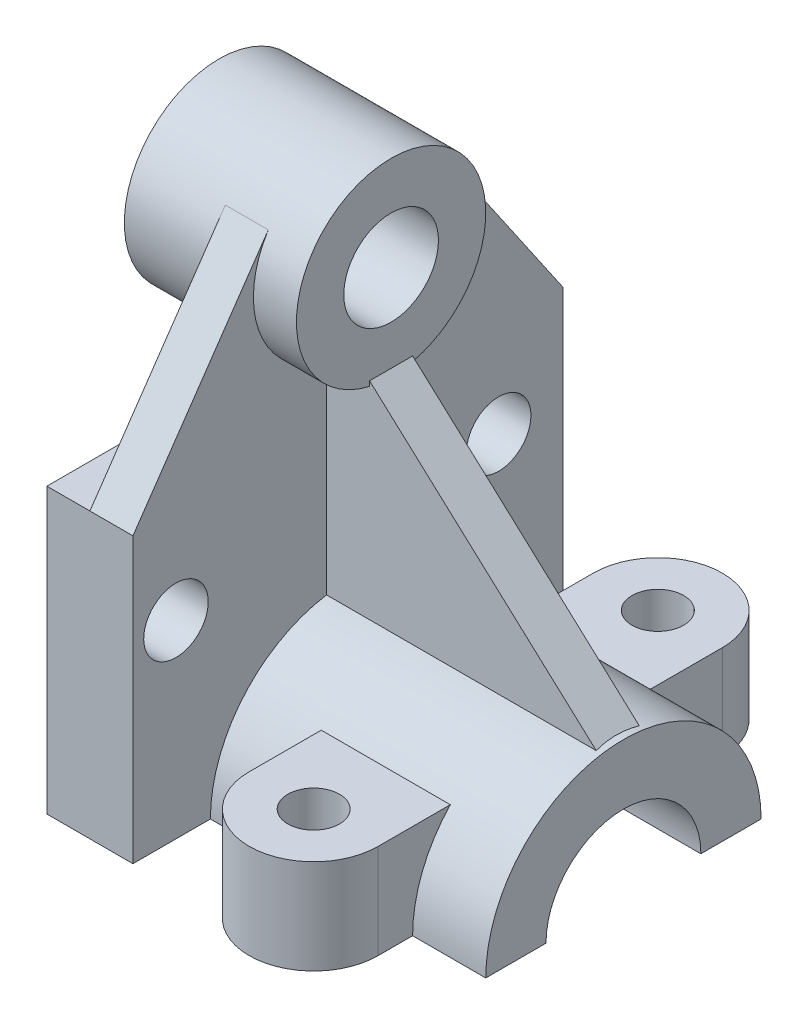
ISO-10303-21;
HEADER;
FILE_DESCRIPTION(('STEP AP214'),'2;1');
FILE_NAME('part.step','',(''),(''),'','','');
FILE_SCHEMA(('AUTOMOTIVE_DESIGN { 1 0 10303 214 1 1 1 1 }'));
ENDSEC;
DATA;
#1=APPLICATION_CONTEXT('core data for automotive mechanical design processes');
#2=APPLICATION_PROTOCOL_DEFINITION('international standard','automotive_design',2000,#1);
#3=PRODUCT_CONTEXT('',#1,'mechanical');
#4=PRODUCT('Part','Part','',(#3));
#5=PRODUCT_RELATED_PRODUCT_CATEGORY('part','',(#4));
#6=PRODUCT_DEFINITION_FORMATION('','',#4);
#7=PRODUCT_DEFINITION_CONTEXT('part definition',#1,'design');
#8=PRODUCT_DEFINITION('design','',#6,#7);
#9=PRODUCT_DEFINITION_SHAPE('','',#8);
#10=(LENGTH_UNIT() NAMED_UNIT(*) SI_UNIT(.MILLI.,.METRE.));
#11=(NAMED_UNIT(*) PLANE_ANGLE_UNIT() SI_UNIT($,.RADIAN.));
#12=(NAMED_UNIT(*) SI_UNIT($,.STERADIAN.) SOLID_ANGLE_UNIT());
#13=UNCERTAINTY_MEASURE_WITH_UNIT(LENGTH_MEASURE(1.E-05),#10,'distance_accuracy_value','');
#14=(GEOMETRIC_REPRESENTATION_CONTEXT(3) GLOBAL_UNCERTAINTY_ASSIGNED_CONTEXT((#13)) GLOBAL_UNIT_ASSIGNED_CONTEXT((#10,
#11,#12)) REPRESENTATION_CONTEXT('',''));
#15=CARTESIAN_POINT('',(0.,0.,0.));
#16=DIRECTION('',(0.,0.,1.));
#17=DIRECTION('',(1.,0.,0.));
#18=AXIS2_PLACEMENT_3D('',#15,#16,#17);
#19=CARTESIAN_POINT('',(-2.10138248847927,66.,-100.));
#20=DIRECTION('',(1.,0.,0.));
#21=DIRECTION('',(0.,1.,0.));
#22=AXIS2_PLACEMENT_3D('',#19,#20,#21);
#23=PLANE('',#22);
#24=CARTESIAN_POINT('',(-2.10138248847927,44.,-85.));
#25=DIRECTION('',(1.,0.,0.));
#26=DIRECTION('',(0.,1.,0.));
#27=AXIS2_PLACEMENT_3D('',#24,#25,#26);
#28=CIRCLE('',#27,7.50000000000001);
#29=CARTESIAN_POINT('',(-2.10138248847927,51.5,-85.));
#30=VERTEX_POINT('',#29);
#31=EDGE_CURVE('E408',#30,#30,#28,.T.);
#32=ORIENTED_EDGE('',*,*,#31,.F.);
#33=EDGE_LOOP('',(#32));
#34=FACE_BOUND('',#33,.T.);
#35=CARTESIAN_POINT('',(-2.10138248847928,100.,-50.));
#36=DIRECTION('',(1.,0.,0.));
#37=DIRECTION('',(0.,1.,0.));
#38=AXIS2_PLACEMENT_3D('',#35,#36,#37);
#39=CIRCLE('',#38,22.);
#40=CARTESIAN_POINT('',(-2.10138248847927,78.5757147143715,-55.));
#41=VERTEX_POINT('',#40);
#42=CARTESIAN_POINT('',(-2.10138248847927,111.84786490349,-68.537208452964));
#43=VERTEX_POINT('',#42);
#44=EDGE_CURVE('E353',#41,#43,#39,.T.);
#45=ORIENTED_EDGE('',*,*,#44,.F.);
#46=DIRECTION('',(0.,-1.,0.));
#47=VECTOR('',#46,1.);
#48=CARTESIAN_POINT('',(-2.10138248847927,66.,-55.));
#49=LINE('',#48,#47);
#50=CARTESIAN_POINT('',(-2.10138248847926,31.6069612585582,-55.));
#51=VERTEX_POINT('',#50);
#52=EDGE_CURVE('E291',#41,#51,#49,.T.);
#53=ORIENTED_EDGE('',*,*,#52,.T.);
#54=CARTESIAN_POINT('',(-2.10138248847926,0.,-50.));
#55=DIRECTION('',(1.,0.,0.));
#56=DIRECTION('',(0.,1.,0.));
#57=AXIS2_PLACEMENT_3D('',#54,#55,#56);
#58=CIRCLE('',#57,32.);
#59=CARTESIAN_POINT('',(-2.10138248847926,0.,-82.));
#60=VERTEX_POINT('',#59);
#61=EDGE_CURVE('E307',#60,#51,#58,.T.);
#62=ORIENTED_EDGE('',*,*,#61,.F.);
#63=DIRECTION('',(0.,0.,1.));
#64=VECTOR('',#63,1.);
#65=CARTESIAN_POINT('',(-2.10138248847926,0.,-100.));
#66=LINE('',#65,#64);
#67=CARTESIAN_POINT('',(-2.10138248847926,0.,-100.));
#68=VERTEX_POINT('',#67);
#69=EDGE_CURVE('E396',#68,#60,#66,.T.);
#70=ORIENTED_EDGE('',*,*,#69,.F.);
#71=DIRECTION('',(0.,1.,0.));
#72=VECTOR('',#71,1.);
#73=CARTESIAN_POINT('',(-2.10138248847927,66.,-100.));
#74=LINE('',#73,#72);
#75=CARTESIAN_POINT('',(-2.10138248847927,66.,-100.));
#76=VERTEX_POINT('',#75);
#77=EDGE_CURVE('E370',#68,#76,#74,.T.);
#78=ORIENTED_EDGE('',*,*,#77,.T.);
#79=DIRECTION('',(0.,-0.824525346118372,-0.565825020309617));
#80=VECTOR('',#79,1.);
#81=CARTESIAN_POINT('',(-2.10138248847927,67.7841320094752,-98.7756513062348));
#82=LINE('',#81,#80);
#83=EDGE_CURVE('E349',#43,#76,#82,.T.);
#84=ORIENTED_EDGE('',*,*,#83,.F.);
#85=EDGE_LOOP('',(#45,#53,#62,#70,#78,#84));
#86=FACE_BOUND('',#85,.T.);
#87=ADVANCED_FACE('F39',(#34,#86),#23,.T.);
#88=CARTESIAN_POINT('',(-12.1013824884793,100.,-50.));
#89=DIRECTION('',(1.,0.,0.));
#90=DIRECTION('',(0.,1.,0.));
#91=AXIS2_PLACEMENT_3D('',#88,#89,#90);
#92=CYLINDRICAL_SURFACE('',#91,22.);
#93=CARTESIAN_POINT('',(-32.1013824884793,100.,-50.));
#94=DIRECTION('',(1.,0.,0.));
#95=DIRECTION('',(0.,1.,0.));
#96=AXIS2_PLACEMENT_3D('',#93,#94,#95);
#97=CIRCLE('',#96,22.);
#98=CARTESIAN_POINT('',(-32.1013824884793,122.,-50.));
#99=VERTEX_POINT('',#98);
#100=EDGE_CURVE('E331',#99,#99,#97,.T.);
#101=ORIENTED_EDGE('',*,*,#100,.T.);
#102=EDGE_LOOP('',(#101));
#103=FACE_BOUND('',#102,.T.);
#104=CARTESIAN_POINT('',(7.89861751152072,100.,-50.));
#105=DIRECTION('',(1.,0.,0.));
#106=DIRECTION('',(0.,1.,0.));
#107=AXIS2_PLACEMENT_3D('',#104,#105,#106);
#108=CIRCLE('',#107,22.);
#109=CARTESIAN_POINT('',(7.89861751152071,78.5757147143715,-55.));
#110=VERTEX_POINT('',#109);
#111=CARTESIAN_POINT('',(7.89861751152071,78.5757147143715,-45.));
#112=VERTEX_POINT('',#111);
#113=EDGE_CURVE('E346',#110,#112,#108,.T.);
#114=ORIENTED_EDGE('',*,*,#113,.F.);
#115=DIRECTION('',(1.,0.,0.));
#116=VECTOR('',#115,1.);
#117=CARTESIAN_POINT('',(-12.1013824884793,78.5757147143715,-55.));
#118=LINE('',#117,#116);
#119=EDGE_CURVE('E294',#110,#41,#118,.F.);
#120=ORIENTED_EDGE('',*,*,#119,.T.);
#121=ORIENTED_EDGE('',*,*,#44,.T.);
#122=DIRECTION('',(1.,0.,0.));
#123=VECTOR('',#122,1.);
#124=CARTESIAN_POINT('',(-32.1013824884793,111.84786490349,-68.537208452964));
#125=LINE('',#124,#123);
#126=CARTESIAN_POINT('',(-12.1013824884793,111.847864903491,-68.5372084529638));
#127=VERTEX_POINT('',#126);
#128=EDGE_CURVE('E340',#127,#43,#125,.T.);
#129=ORIENTED_EDGE('',*,*,#128,.F.);
#130=CARTESIAN_POINT('',(-12.1013824884793,100.,-50.));
#131=DIRECTION('',(1.,0.,0.));
#132=DIRECTION('',(0.,1.,0.));
#133=AXIS2_PLACEMENT_3D('',#130,#131,#132);
#134=CIRCLE('',#133,22.);
#135=CARTESIAN_POINT('',(-12.1013824884793,111.847864903491,-31.4627915470364));
#136=VERTEX_POINT('',#135);
#137=EDGE_CURVE('E337',#136,#127,#134,.T.);
#138=ORIENTED_EDGE('',*,*,#137,.F.);
#139=DIRECTION('',(1.,0.,0.));
#140=VECTOR('',#139,1.);
#141=CARTESIAN_POINT('',(-32.1013824884793,111.847864903491,-31.4627915470364));
#142=LINE('',#141,#140);
#143=CARTESIAN_POINT('',(-2.10138248847928,111.847864903491,-31.4627915470362));
#144=VERTEX_POINT('',#143);
#145=EDGE_CURVE('E334',#144,#136,#142,.F.);
#146=ORIENTED_EDGE('',*,*,#145,.F.);
#147=CARTESIAN_POINT('',(-2.10138248847927,78.5757147143715,-45.));
#148=VERTEX_POINT('',#147);
#149=EDGE_CURVE('E350',#144,#148,#39,.T.);
#150=ORIENTED_EDGE('',*,*,#149,.T.);
#151=DIRECTION('',(1.,0.,0.));
#152=VECTOR('',#151,1.);
#153=CARTESIAN_POINT('',(-12.1013824884793,78.5757147143715,-45.));
#154=LINE('',#153,#152);
#155=EDGE_CURVE('E285',#112,#148,#154,.F.);
#156=ORIENTED_EDGE('',*,*,#155,.F.);
#157=EDGE_LOOP('',(#114,#120,#121,#129,#138,#146,#150,#156));
#158=FACE_BOUND('',#157,.T.);
#159=ADVANCED_FACE('F433',(#103,#158),#92,.T.);
#160=CARTESIAN_POINT('',(7.89861751152072,100.,-50.));
#161=DIRECTION('',(1.,0.,0.));
#162=DIRECTION('',(0.,1.,0.));
#163=AXIS2_PLACEMENT_3D('',#160,#161,#162);
#164=PLANE('',#163);
#165=CARTESIAN_POINT('',(7.89861751152072,100.,-50.));
#166=DIRECTION('',(1.,0.,0.));
#167=DIRECTION('',(0.,1.,0.));
#168=AXIS2_PLACEMENT_3D('',#165,#166,#167);
#169=CIRCLE('',#168,11.);
#170=CARTESIAN_POINT('',(7.89861751152072,111.,-50.));
#171=VERTEX_POINT('',#170);
#172=EDGE_CURVE('E343',#171,#171,#169,.T.);
#173=ORIENTED_EDGE('',*,*,#172,.F.);
#174=EDGE_LOOP('',(#173));
#175=FACE_BOUND('',#174,.T.);
#176=DIRECTION('',(0.,0.,1.));
#177=VECTOR('',#176,1.);
#178=CARTESIAN_POINT('',(7.89861751152073,79.7071357753525,-55.));
#179=LINE('',#178,#177);
#180=CARTESIAN_POINT('',(7.89861751152073,79.7071357753525,-55.));
#181=VERTEX_POINT('',#180);
#182=CARTESIAN_POINT('',(7.89861751152073,79.7071357753525,-45.));
#183=VERTEX_POINT('',#182);
#184=EDGE_CURVE('E276',#181,#183,#179,.T.);
#185=ORIENTED_EDGE('',*,*,#184,.F.);
#186=DIRECTION('',(0.,-1.,0.));
#187=VECTOR('',#186,1.);
#188=CARTESIAN_POINT('',(7.89861751152072,100.,-55.));
#189=LINE('',#188,#187);
#190=EDGE_CURVE('E297',#181,#110,#189,.T.);
#191=ORIENTED_EDGE('',*,*,#190,.T.);
#192=ORIENTED_EDGE('',*,*,#113,.T.);
#193=DIRECTION('',(0.,-1.,0.));
#194=VECTOR('',#193,1.);
#195=CARTESIAN_POINT('',(7.89861751152072,100.,-45.));
#196=LINE('',#195,#194);
#197=EDGE_CURVE('E287',#183,#112,#196,.T.);
#198=ORIENTED_EDGE('',*,*,#197,.F.);
#199=EDGE_LOOP('',(#185,#191,#192,#198));
#200=FACE_BOUND('',#199,.T.);
#201=ADVANCED_FACE('F440',(#175,#200),#164,.T.);
#202=CARTESIAN_POINT('',(61.8986175115207,0.,-50.));
#203=DIRECTION('',(-1.,0.,0.));
#204=DIRECTION('',(0.,-1.,0.));
#205=AXIS2_PLACEMENT_3D('',#202,#203,#204);
#206=CYLINDRICAL_SURFACE('',#205,32.);
#207=DIRECTION('',(-1.,0.,0.));
#208=VECTOR('',#207,1.);
#209=CARTESIAN_POINT('',(61.8986175115207,0.,-82.));
#210=LINE('',#209,#208);
#211=CARTESIAN_POINT('',(61.8986175115207,0.,-82.));
#212=VERTEX_POINT('',#211);
#213=CARTESIAN_POINT('',(44.8986175115207,0.,-82.));
#214=VERTEX_POINT('',#213);
#215=EDGE_CURVE('E324',#212,#214,#210,.T.);
#216=ORIENTED_EDGE('',*,*,#215,.T.);
#217=CARTESIAN_POINT('',(44.8986175115207,0.,-50.));
#218=DIRECTION('',(1.,0.,0.));
#219=DIRECTION('',(0.,1.,0.));
#220=AXIS2_PLACEMENT_3D('',#217,#218,#219);
#221=CIRCLE('',#220,32.);
#222=CARTESIAN_POINT('',(44.8986175115207,22.,-73.2379000772445));
#223=VERTEX_POINT('',#222);
#224=EDGE_CURVE('E56',#214,#223,#221,.T.);
#225=ORIENTED_EDGE('',*,*,#224,.T.);
#226=DIRECTION('',(-1.,0.,0.));
#227=VECTOR('',#226,1.);
#228=CARTESIAN_POINT('',(61.8986175115207,22.,-73.2379000772445));
#229=LINE('',#228,#227);
#230=CARTESIAN_POINT('',(14.8986175115207,22.,-73.2379000772445));
#231=VERTEX_POINT('',#230);
#232=EDGE_CURVE('E11',#231,#223,#229,.F.);
#233=ORIENTED_EDGE('',*,*,#232,.F.);
#234=CARTESIAN_POINT('',(14.8986175115207,0.,-50.));
#235=DIRECTION('',(-1.,0.,0.));
#236=DIRECTION('',(0.,0.,1.));
#237=AXIS2_PLACEMENT_3D('',#234,#235,#236);
#238=CIRCLE('',#237,32.);
#239=CARTESIAN_POINT('',(14.8986175115207,0.,-82.));
#240=VERTEX_POINT('',#239);
#241=EDGE_CURVE('E235',#231,#240,#238,.T.);
#242=ORIENTED_EDGE('',*,*,#241,.T.);
#243=EDGE_CURVE('E323',#240,#60,#210,.T.);
#244=ORIENTED_EDGE('',*,*,#243,.T.);
#245=ORIENTED_EDGE('',*,*,#61,.T.);
#246=DIRECTION('',(-1.,0.,0.));
#247=VECTOR('',#246,1.);
#248=CARTESIAN_POINT('',(61.8986175115207,31.6069612585582,-55.));
#249=LINE('',#248,#247);
#250=CARTESIAN_POINT('',(60.5799763867612,31.6069612585582,-55.));
#251=VERTEX_POINT('',#250);
#252=EDGE_CURVE('E289',#251,#51,#249,.T.);
#253=ORIENTED_EDGE('',*,*,#252,.F.);
#254=CARTESIAN_POINT('',(95.1972659443398,0.,-50.));
#255=DIRECTION('',(-0.674267860809135,-0.738486866423414,0.));
#256=DIRECTION('',(-0.738486866423414,0.674267860809135,0.));
#257=AXIS2_PLACEMENT_3D('',#254,#255,#256);
#258=ELLIPSE('',#257,47.4588837166276,32.);
#259=CARTESIAN_POINT('',(60.5799763867612,31.6069612585582,-45.));
#260=VERTEX_POINT('',#259);
#261=EDGE_CURVE('E300',#260,#251,#258,.T.);
#262=ORIENTED_EDGE('',*,*,#261,.F.);
#263=DIRECTION('',(-1.,0.,0.));
#264=VECTOR('',#263,1.);
#265=CARTESIAN_POINT('',(61.8986175115207,31.6069612585582,-45.));
#266=LINE('',#265,#264);
#267=CARTESIAN_POINT('',(-2.10138248847927,31.6069612585582,-45.));
#268=VERTEX_POINT('',#267);
#269=EDGE_CURVE('E280',#260,#268,#266,.T.);
#270=ORIENTED_EDGE('',*,*,#269,.T.);
#271=CARTESIAN_POINT('',(-2.10138248847926,0.,-18.));
#272=VERTEX_POINT('',#271);
#273=EDGE_CURVE('E314',#268,#272,#58,.T.);
#274=ORIENTED_EDGE('',*,*,#273,.T.);
#275=DIRECTION('',(-1.,0.,0.));
#276=VECTOR('',#275,1.);
#277=CARTESIAN_POINT('',(61.8986175115207,0.,-18.));
#278=LINE('',#277,#276);
#279=CARTESIAN_POINT('',(14.8986175115207,0.,-18.));
#280=VERTEX_POINT('',#279);
#281=EDGE_CURVE('E319',#280,#272,#278,.T.);
#282=ORIENTED_EDGE('',*,*,#281,.F.);
#283=CARTESIAN_POINT('',(14.8986175115207,0.,-50.));
#284=DIRECTION('',(-1.,0.,0.));
#285=DIRECTION('',(0.,-1.,0.));
#286=AXIS2_PLACEMENT_3D('',#283,#284,#285);
#287=CIRCLE('',#286,32.);
#288=CARTESIAN_POINT('',(14.8986175115207,22.,-26.7620999227555));
#289=VERTEX_POINT('',#288);
#290=EDGE_CURVE('E269',#280,#289,#287,.T.);
#291=ORIENTED_EDGE('',*,*,#290,.T.);
#292=DIRECTION('',(-1.,0.,0.));
#293=VECTOR('',#292,1.);
#294=CARTESIAN_POINT('',(61.8986175115207,22.,-26.7620999227555));
#295=LINE('',#294,#293);
#296=CARTESIAN_POINT('',(44.8986175115207,22.,-26.7620999227555));
#297=VERTEX_POINT('',#296);
#298=EDGE_CURVE('E48',#289,#297,#295,.F.);
#299=ORIENTED_EDGE('',*,*,#298,.T.);
#300=CARTESIAN_POINT('',(44.8986175115207,0.,-50.));
#301=DIRECTION('',(1.,0.,0.));
#302=DIRECTION('',(0.,0.,-1.));
#303=AXIS2_PLACEMENT_3D('',#300,#301,#302);
#304=CIRCLE('',#303,32.);
#305=CARTESIAN_POINT('',(44.8986175115207,0.,-18.));
#306=VERTEX_POINT('',#305);
#307=EDGE_CURVE('E264',#297,#306,#304,.T.);
#308=ORIENTED_EDGE('',*,*,#307,.T.);
#309=CARTESIAN_POINT('',(61.8986175115207,0.,-18.));
#310=VERTEX_POINT('',#309);
#311=EDGE_CURVE('E320',#310,#306,#278,.T.);
#312=ORIENTED_EDGE('',*,*,#311,.F.);
#313=CARTESIAN_POINT('',(61.8986175115207,0.,-50.));
#314=DIRECTION('',(1.,0.,0.));
#315=DIRECTION('',(0.,1.,0.));
#316=AXIS2_PLACEMENT_3D('',#313,#314,#315);
#317=CIRCLE('',#316,32.);
#318=EDGE_CURVE('E309',#212,#310,#317,.T.);
#319=ORIENTED_EDGE('',*,*,#318,.F.);
#320=EDGE_LOOP('',(#216,#225,#233,#242,#244,#245,#253,#262,#270,#274,#282,#291,#299,#308,#312,#319));
#321=FACE_BOUND('',#320,.T.);
#322=ADVANCED_FACE('F447',(#321),#206,.T.);
#323=CARTESIAN_POINT('',(-2.10138248847927,44.,-10.));
#324=DIRECTION('',(1.,0.,0.));
#325=DIRECTION('',(0.,1.,0.));
#326=AXIS2_PLACEMENT_3D('',#323,#324,#325);
#327=CIRCLE('',#326,7.5);
#328=CARTESIAN_POINT('',(-2.10138248847927,51.5,-10.));
#329=VERTEX_POINT('',#328);
#330=EDGE_CURVE('E403',#329,#329,#327,.T.);
#331=ORIENTED_EDGE('',*,*,#330,.F.);
#332=EDGE_LOOP('',(#331));
#333=FACE_BOUND('',#332,.T.);
#334=DIRECTION('',(0.,-1.,0.));
#335=VECTOR('',#334,1.);
#336=CARTESIAN_POINT('',(-2.10138248847927,66.,-45.));
#337=LINE('',#336,#335);
#338=EDGE_CURVE('E283',#148,#268,#337,.T.);
#339=ORIENTED_EDGE('',*,*,#338,.F.);
#340=ORIENTED_EDGE('',*,*,#149,.F.);
#341=DIRECTION('',(0.,0.824525346118372,-0.565825020309617));
#342=VECTOR('',#341,1.);
#343=CARTESIAN_POINT('',(-2.10138248847927,21.130424938153,30.7914466670727));
#344=LINE('',#343,#342);
#345=CARTESIAN_POINT('',(-2.10138248847927,66.,0.));
#346=VERTEX_POINT('',#345);
#347=EDGE_CURVE('E357',#346,#144,#344,.T.);
#348=ORIENTED_EDGE('',*,*,#347,.F.);
#349=DIRECTION('',(0.,1.,0.));
#350=VECTOR('',#349,1.);
#351=CARTESIAN_POINT('',(-2.10138248847927,66.,0.));
#352=LINE('',#351,#350);
#353=CARTESIAN_POINT('',(-2.10138248847926,0.,0.));
#354=VERTEX_POINT('',#353);
#355=EDGE_CURVE('E384',#354,#346,#352,.T.);
#356=ORIENTED_EDGE('',*,*,#355,.F.);
#357=EDGE_CURVE('E381',#272,#354,#66,.T.);
#358=ORIENTED_EDGE('',*,*,#357,.F.);
#359=ORIENTED_EDGE('',*,*,#273,.F.);
#360=EDGE_LOOP('',(#339,#340,#348,#356,#358,#359));
#361=FACE_BOUND('',#360,.T.);
#362=ADVANCED_FACE('F435',(#333,#361),#23,.T.);
#363=CARTESIAN_POINT('',(-2.10138248847926,0.,-100.));
#364=DIRECTION('',(0.,-1.,0.));
#365=DIRECTION('',(1.,0.,0.));
#366=AXIS2_PLACEMENT_3D('',#363,#364,#365);
#367=PLANE('',#366);
#368=ORIENTED_EDGE('',*,*,#243,.F.);
#369=DIRECTION('',(0.,0.,-1.));
#370=VECTOR('',#369,1.);
#371=CARTESIAN_POINT('',(14.8986175115207,0.,-68.));
#372=LINE('',#371,#370);
#373=CARTESIAN_POINT('',(14.8986175115207,0.,-90.));
#374=VERTEX_POINT('',#373);
#375=EDGE_CURVE('E218',#240,#374,#372,.T.);
#376=ORIENTED_EDGE('',*,*,#375,.T.);
#377=CARTESIAN_POINT('',(29.8986175115207,0.,-90.));
#378=DIRECTION('',(0.,-1.,0.));
#379=DIRECTION('',(1.,0.,0.));
#380=AXIS2_PLACEMENT_3D('',#377,#378,#379);
#381=CIRCLE('',#380,15.);
#382=CARTESIAN_POINT('',(44.8986175115207,0.,-90.));
#383=VERTEX_POINT('',#382);
#384=EDGE_CURVE('E203',#374,#383,#381,.T.);
#385=ORIENTED_EDGE('',*,*,#384,.T.);
#386=DIRECTION('',(0.,0.,1.));
#387=VECTOR('',#386,1.);
#388=CARTESIAN_POINT('',(44.8986175115207,0.,-68.));
#389=LINE('',#388,#387);
#390=EDGE_CURVE('E216',#383,#214,#389,.T.);
#391=ORIENTED_EDGE('',*,*,#390,.T.);
#392=ORIENTED_EDGE('',*,*,#215,.F.);
#393=DIRECTION('',(0.,0.,-1.));
#394=VECTOR('',#393,1.);
#395=CARTESIAN_POINT('',(61.8986175115207,0.,0.));
#396=LINE('',#395,#394);
#397=CARTESIAN_POINT('',(61.8986175115207,0.,-68.));
#398=VERTEX_POINT('',#397);
#399=EDGE_CURVE('E306',#398,#212,#396,.T.);
#400=ORIENTED_EDGE('',*,*,#399,.F.);
#401=DIRECTION('',(-1.,0.,0.));
#402=VECTOR('',#401,1.);
#403=CARTESIAN_POINT('',(61.8986175115207,0.,-68.));
#404=LINE('',#403,#402);
#405=CARTESIAN_POINT('',(-2.10138248847926,0.,-68.));
#406=VERTEX_POINT('',#405);
#407=EDGE_CURVE('E326',#398,#406,#404,.T.);
#408=ORIENTED_EDGE('',*,*,#407,.T.);
#409=CARTESIAN_POINT('',(-2.10138248847926,0.,-32.));
#410=VERTEX_POINT('',#409);
#411=EDGE_CURVE('E399',#406,#410,#66,.T.);
#412=ORIENTED_EDGE('',*,*,#411,.T.);
#413=DIRECTION('',(-1.,0.,0.));
#414=VECTOR('',#413,1.);
#415=CARTESIAN_POINT('',(61.8986175115207,0.,-32.));
#416=LINE('',#415,#414);
#417=CARTESIAN_POINT('',(61.8986175115207,0.,-32.));
#418=VERTEX_POINT('',#417);
#419=EDGE_CURVE('E317',#418,#410,#416,.T.);
#420=ORIENTED_EDGE('',*,*,#419,.F.);
#421=EDGE_CURVE('E310',#310,#418,#396,.T.);
#422=ORIENTED_EDGE('',*,*,#421,.F.);
#423=ORIENTED_EDGE('',*,*,#311,.T.);
#424=DIRECTION('',(0.,0.,1.));
#425=VECTOR('',#424,1.);
#426=CARTESIAN_POINT('',(44.8986175115207,0.,-32.));
#427=LINE('',#426,#425);
#428=CARTESIAN_POINT('',(44.8986175115207,0.,-10.));
#429=VERTEX_POINT('',#428);
#430=EDGE_CURVE('E244',#306,#429,#427,.T.);
#431=ORIENTED_EDGE('',*,*,#430,.T.);
#432=CARTESIAN_POINT('',(29.8986175115207,0.,-10.));
#433=DIRECTION('',(0.,-1.,0.));
#434=DIRECTION('',(-1.,0.,0.));
#435=AXIS2_PLACEMENT_3D('',#432,#433,#434);
#436=CIRCLE('',#435,15.);
#437=CARTESIAN_POINT('',(14.8986175115207,0.,-10.));
#438=VERTEX_POINT('',#437);
#439=EDGE_CURVE('E258',#429,#438,#436,.T.);
#440=ORIENTED_EDGE('',*,*,#439,.T.);
#441=DIRECTION('',(0.,0.,-1.));
#442=VECTOR('',#441,1.);
#443=CARTESIAN_POINT('',(14.8986175115207,0.,-32.));
#444=LINE('',#443,#442);
#445=EDGE_CURVE('E250',#438,#280,#444,.T.);
#446=ORIENTED_EDGE('',*,*,#445,.T.);
#447=ORIENTED_EDGE('',*,*,#281,.T.);
#448=ORIENTED_EDGE('',*,*,#357,.T.);
#449=DIRECTION('',(1.,0.,0.));
#450=VECTOR('',#449,1.);
#451=CARTESIAN_POINT('',(-2.10138248847926,0.,0.));
#452=LINE('',#451,#450);
#453=CARTESIAN_POINT('',(-22.1013824884793,0.,0.));
#454=VERTEX_POINT('',#453);
#455=EDGE_CURVE('E363',#454,#354,#452,.T.);
#456=ORIENTED_EDGE('',*,*,#455,.F.);
#457=DIRECTION('',(0.,0.,1.));
#458=VECTOR('',#457,1.);
#459=CARTESIAN_POINT('',(-22.1013824884793,0.,-100.));
#460=LINE('',#459,#458);
#461=CARTESIAN_POINT('',(-22.1013824884793,0.,-100.));
#462=VERTEX_POINT('',#461);
#463=EDGE_CURVE('E391',#462,#454,#460,.T.);
#464=ORIENTED_EDGE('',*,*,#463,.F.);
#465=DIRECTION('',(1.,0.,0.));
#466=VECTOR('',#465,1.);
#467=CARTESIAN_POINT('',(-2.10138248847926,0.,-100.));
#468=LINE('',#467,#466);
#469=EDGE_CURVE('E367',#462,#68,#468,.T.);
#470=ORIENTED_EDGE('',*,*,#469,.T.);
#471=ORIENTED_EDGE('',*,*,#69,.T.);
#472=EDGE_LOOP('',(#368,#376,#385,#391,#392,#400,#408,#412,#420,#422,#423,#431,#440,#446,#447,
#448,#456,#464,#470,#471));
#473=FACE_BOUND('',#472,.T.);
#474=CARTESIAN_POINT('',(29.8986175115207,0.,-10.));
#475=DIRECTION('',(0.,-1.,0.));
#476=DIRECTION('',(1.,0.,0.));
#477=AXIS2_PLACEMENT_3D('',#474,#475,#476);
#478=CIRCLE('',#477,6.);
#479=CARTESIAN_POINT('',(35.8986175115207,0.,-10.));
#480=VERTEX_POINT('',#479);
#481=EDGE_CURVE('E240',#480,#480,#478,.T.);
#482=ORIENTED_EDGE('',*,*,#481,.F.);
#483=EDGE_LOOP('',(#482));
#484=FACE_BOUND('',#483,.T.);
#485=CARTESIAN_POINT('',(29.8986175115207,0.,-90.));
#486=DIRECTION('',(0.,-1.,0.));
#487=DIRECTION('',(1.,0.,0.));
#488=AXIS2_PLACEMENT_3D('',#485,#486,#487);
#489=CIRCLE('',#488,6.);
#490=CARTESIAN_POINT('',(35.8986175115207,0.,-90.));
#491=VERTEX_POINT('',#490);
#492=EDGE_CURVE('E232',#491,#491,#489,.T.);
#493=ORIENTED_EDGE('',*,*,#492,.F.);
#494=EDGE_LOOP('',(#493));
#495=FACE_BOUND('',#494,.T.);
#496=ADVANCED_FACE('F41',(#473,#484,#495),#367,.T.);
#497=CARTESIAN_POINT('',(-22.1013824884793,0.,-100.));
#498=DIRECTION('',(-1.,0.,0.));
#499=DIRECTION('',(0.,0.,1.));
#500=AXIS2_PLACEMENT_3D('',#497,#498,#499);
#501=PLANE('',#500);
#502=CARTESIAN_POINT('',(-22.1013824884793,44.,-10.));
#503=DIRECTION('',(-1.,0.,0.));
#504=DIRECTION('',(0.,0.,1.));
#505=AXIS2_PLACEMENT_3D('',#502,#503,#504);
#506=CIRCLE('',#505,7.5);
#507=CARTESIAN_POINT('',(-22.1013824884793,44.,-2.5));
#508=VERTEX_POINT('',#507);
#509=EDGE_CURVE('E43',#508,#508,#506,.T.);
#510=ORIENTED_EDGE('',*,*,#509,.F.);
#511=EDGE_LOOP('',(#510));
#512=FACE_BOUND('',#511,.T.);
#513=CARTESIAN_POINT('',(-22.1013824884793,44.,-85.));
#514=DIRECTION('',(-1.,0.,0.));
#515=DIRECTION('',(0.,0.,1.));
#516=AXIS2_PLACEMENT_3D('',#513,#514,#515);
#517=CIRCLE('',#516,7.50000000000001);
#518=CARTESIAN_POINT('',(-22.1013824884793,44.,-77.5));
#519=VERTEX_POINT('',#518);
#520=EDGE_CURVE('E401',#519,#519,#517,.T.);
#521=ORIENTED_EDGE('',*,*,#520,.F.);
#522=EDGE_LOOP('',(#521));
#523=FACE_BOUND('',#522,.T.);
#524=DIRECTION('',(0.,-1.,0.));
#525=VECTOR('',#524,1.);
#526=CARTESIAN_POINT('',(-22.1013824884793,0.,0.));
#527=LINE('',#526,#525);
#528=CARTESIAN_POINT('',(-22.1013824884793,66.,0.));
#529=VERTEX_POINT('',#528);
#530=EDGE_CURVE('E371',#529,#454,#527,.T.);
#531=ORIENTED_EDGE('',*,*,#530,.F.);
#532=DIRECTION('',(0.,0.,1.));
#533=VECTOR('',#532,1.);
#534=CARTESIAN_POINT('',(-22.1013824884793,66.,-100.));
#535=LINE('',#534,#533);
#536=CARTESIAN_POINT('',(-22.1013824884793,66.,-100.));
#537=VERTEX_POINT('',#536);
#538=EDGE_CURVE('E393',#537,#529,#535,.T.);
#539=ORIENTED_EDGE('',*,*,#538,.F.);
#540=DIRECTION('',(0.,-1.,0.));
#541=VECTOR('',#540,1.);
#542=CARTESIAN_POINT('',(-22.1013824884793,0.,-100.));
#543=LINE('',#542,#541);
#544=EDGE_CURVE('E378',#537,#462,#543,.T.);
#545=ORIENTED_EDGE('',*,*,#544,.T.);
#546=ORIENTED_EDGE('',*,*,#463,.T.);
#547=EDGE_LOOP('',(#531,#539,#545,#546));
#548=FACE_BOUND('',#547,.T.);
#549=ADVANCED_FACE('F460',(#512,#523,#548),#501,.T.);
#550=CARTESIAN_POINT('',(-22.1013824884793,66.,-100.));
#551=DIRECTION('',(0.,1.,0.));
#552=DIRECTION('',(0.,0.,1.));
#553=AXIS2_PLACEMENT_3D('',#550,#551,#552);
#554=PLANE('',#553);
#555=DIRECTION('',(0.,0.,1.));
#556=VECTOR('',#555,1.);
#557=CARTESIAN_POINT('',(-12.1013824884793,66.,0.));
#558=LINE('',#557,#556);
#559=CARTESIAN_POINT('',(-12.1013824884793,66.,-100.));
#560=VERTEX_POINT('',#559);
#561=CARTESIAN_POINT('',(-12.1013824884793,66.,0.));
#562=VERTEX_POINT('',#561);
#563=EDGE_CURVE('E360',#560,#562,#558,.T.);
#564=ORIENTED_EDGE('',*,*,#563,.F.);
#565=DIRECTION('',(-1.,0.,0.));
#566=VECTOR('',#565,1.);
#567=CARTESIAN_POINT('',(-22.1013824884793,66.,-100.));
#568=LINE('',#567,#566);
#569=EDGE_CURVE('E374',#560,#537,#568,.T.);
#570=ORIENTED_EDGE('',*,*,#569,.T.);
#571=ORIENTED_EDGE('',*,*,#538,.T.);
#572=DIRECTION('',(-1.,0.,0.));
#573=VECTOR('',#572,1.);
#574=CARTESIAN_POINT('',(-22.1013824884793,66.,0.));
#575=LINE('',#574,#573);
#576=EDGE_CURVE('E386',#562,#529,#575,.T.);
#577=ORIENTED_EDGE('',*,*,#576,.F.);
#578=EDGE_LOOP('',(#564,#570,#571,#577));
#579=FACE_BOUND('',#578,.T.);
#580=ADVANCED_FACE('F451',(#579),#554,.T.);
#581=CARTESIAN_POINT('',(-2.10138248847926,0.,-50.));
#582=DIRECTION('',(1.,0.,0.));
#583=DIRECTION('',(0.,1.,0.));
#584=AXIS2_PLACEMENT_3D('',#581,#582,#583);
#585=CIRCLE('',#584,18.);
#586=EDGE_CURVE('E302',#406,#410,#585,.T.);
#587=ORIENTED_EDGE('',*,*,#586,.T.);
#588=ORIENTED_EDGE('',*,*,#411,.F.);
#589=EDGE_LOOP('',(#587,#588));
#590=FACE_BOUND('',#589,.T.);
#591=ADVANCED_FACE('F436',(#590),#23,.T.);
#592=CARTESIAN_POINT('',(0.,0.,-100.));
#593=DIRECTION('',(0.,0.,-1.));
#594=DIRECTION('',(-1.,0.,0.));
#595=AXIS2_PLACEMENT_3D('',#592,#593,#594);
#596=PLANE('',#595);
#597=ORIENTED_EDGE('',*,*,#469,.F.);
#598=ORIENTED_EDGE('',*,*,#544,.F.);
#599=ORIENTED_EDGE('',*,*,#569,.F.);
#600=EDGE_CURVE('E375',#76,#560,#568,.T.);
#601=ORIENTED_EDGE('',*,*,#600,.F.);
#602=ORIENTED_EDGE('',*,*,#77,.F.);
#603=EDGE_LOOP('',(#597,#598,#599,#601,#602));
#604=FACE_BOUND('',#603,.T.);
#605=ADVANCED_FACE('F450',(#604),#596,.T.);
#606=CARTESIAN_POINT('',(0.,0.,0.));
#607=DIRECTION('',(0.,0.,-1.));
#608=DIRECTION('',(-1.,0.,0.));
#609=AXIS2_PLACEMENT_3D('',#606,#607,#608);
#610=PLANE('',#609);
#611=ORIENTED_EDGE('',*,*,#455,.T.);
#612=ORIENTED_EDGE('',*,*,#355,.T.);
#613=EDGE_CURVE('E387',#346,#562,#575,.T.);
#614=ORIENTED_EDGE('',*,*,#613,.T.);
#615=ORIENTED_EDGE('',*,*,#576,.T.);
#616=ORIENTED_EDGE('',*,*,#530,.T.);
#617=EDGE_LOOP('',(#611,#612,#614,#615,#616));
#618=FACE_BOUND('',#617,.T.);
#619=ADVANCED_FACE('F457',(#618),#610,.F.);
#620=CARTESIAN_POINT('',(-12.1013824884793,67.7841320094752,-98.7756513062348));
#621=DIRECTION('',(0.,-0.565825020309617,0.824525346118372));
#622=DIRECTION('',(0.,-0.824525346118372,-0.565825020309617));
#623=AXIS2_PLACEMENT_3D('',#620,#621,#622);
#624=PLANE('',#623);
#625=DIRECTION('',(0.,-0.824525346118372,-0.565825020309617));
#626=VECTOR('',#625,1.);
#627=CARTESIAN_POINT('',(-12.1013824884793,67.7841320094752,-98.7756513062348));
#628=LINE('',#627,#626);
#629=EDGE_CURVE('E354',#127,#560,#628,.T.);
#630=ORIENTED_EDGE('',*,*,#629,.F.);
#631=ORIENTED_EDGE('',*,*,#128,.T.);
#632=ORIENTED_EDGE('',*,*,#83,.T.);
#633=ORIENTED_EDGE('',*,*,#600,.T.);
#634=EDGE_LOOP('',(#630,#631,#632,#633));
#635=FACE_BOUND('',#634,.T.);
#636=ADVANCED_FACE('F522',(#635),#624,.F.);
#637=CARTESIAN_POINT('',(-12.1013824884793,21.130424938153,30.7914466670727));
#638=DIRECTION('',(0.,-0.565825020309617,-0.824525346118372));
#639=DIRECTION('',(0.,0.824525346118372,-0.565825020309617));
#640=AXIS2_PLACEMENT_3D('',#637,#638,#639);
#641=PLANE('',#640);
#642=ORIENTED_EDGE('',*,*,#347,.T.);
#643=ORIENTED_EDGE('',*,*,#145,.T.);
#644=DIRECTION('',(0.,0.824525346118372,-0.565825020309617));
#645=VECTOR('',#644,1.);
#646=CARTESIAN_POINT('',(-12.1013824884793,21.130424938153,30.7914466670727));
#647=LINE('',#646,#645);
#648=EDGE_CURVE('E356',#562,#136,#647,.T.);
#649=ORIENTED_EDGE('',*,*,#648,.F.);
#650=ORIENTED_EDGE('',*,*,#613,.F.);
#651=EDGE_LOOP('',(#642,#643,#649,#650));
#652=FACE_BOUND('',#651,.T.);
#653=ADVANCED_FACE('F519',(#652),#641,.F.);
#654=CARTESIAN_POINT('',(-12.1013824884793,100.,-50.));
#655=DIRECTION('',(1.,0.,0.));
#656=DIRECTION('',(0.,1.,0.));
#657=AXIS2_PLACEMENT_3D('',#654,#655,#656);
#658=CYLINDRICAL_SURFACE('',#657,11.);
#659=ORIENTED_EDGE('',*,*,#172,.T.);
#660=EDGE_LOOP('',(#659));
#661=FACE_BOUND('',#660,.T.);
#662=CARTESIAN_POINT('',(-32.1013824884793,100.,-50.));
#663=DIRECTION('',(1.,0.,0.));
#664=DIRECTION('',(0.,1.,0.));
#665=AXIS2_PLACEMENT_3D('',#662,#663,#664);
#666=CIRCLE('',#665,11.);
#667=CARTESIAN_POINT('',(-32.1013824884793,111.,-50.));
#668=VERTEX_POINT('',#667);
#669=EDGE_CURVE('E328',#668,#668,#666,.T.);
#670=ORIENTED_EDGE('',*,*,#669,.F.);
#671=EDGE_LOOP('',(#670));
#672=FACE_BOUND('',#671,.T.);
#673=ADVANCED_FACE('F515',(#661,#672),#658,.F.);
#674=CARTESIAN_POINT('',(-12.1013824884793,0.,0.));
#675=DIRECTION('',(1.,0.,0.));
#676=DIRECTION('',(0.,1.,0.));
#677=AXIS2_PLACEMENT_3D('',#674,#675,#676);
#678=PLANE('',#677);
#679=ORIENTED_EDGE('',*,*,#648,.T.);
#680=ORIENTED_EDGE('',*,*,#137,.T.);
#681=ORIENTED_EDGE('',*,*,#629,.T.);
#682=ORIENTED_EDGE('',*,*,#563,.T.);
#683=EDGE_LOOP('',(#679,#680,#681,#682));
#684=FACE_BOUND('',#683,.T.);
#685=ADVANCED_FACE('F510',(#684),#678,.F.);
#686=CARTESIAN_POINT('',(-32.1013824884793,100.,-50.));
#687=DIRECTION('',(1.,0.,0.));
#688=DIRECTION('',(0.,1.,0.));
#689=AXIS2_PLACEMENT_3D('',#686,#687,#688);
#690=PLANE('',#689);
#691=ORIENTED_EDGE('',*,*,#669,.T.);
#692=EDGE_LOOP('',(#691));
#693=FACE_BOUND('',#692,.T.);
#694=ORIENTED_EDGE('',*,*,#100,.F.);
#695=EDGE_LOOP('',(#694));
#696=FACE_BOUND('',#695,.T.);
#697=ADVANCED_FACE('F508',(#693,#696),#690,.F.);
#698=CARTESIAN_POINT('',(61.8986175115207,0.,-50.));
#699=DIRECTION('',(-1.,0.,0.));
#700=DIRECTION('',(0.,-1.,0.));
#701=AXIS2_PLACEMENT_3D('',#698,#699,#700);
#702=CYLINDRICAL_SURFACE('',#701,18.);
#703=ORIENTED_EDGE('',*,*,#586,.F.);
#704=ORIENTED_EDGE('',*,*,#407,.F.);
#705=CARTESIAN_POINT('',(61.8986175115207,0.,-50.));
#706=DIRECTION('',(1.,0.,0.));
#707=DIRECTION('',(0.,1.,0.));
#708=AXIS2_PLACEMENT_3D('',#705,#706,#707);
#709=CIRCLE('',#708,18.);
#710=EDGE_CURVE('E303',#398,#418,#709,.T.);
#711=ORIENTED_EDGE('',*,*,#710,.T.);
#712=ORIENTED_EDGE('',*,*,#419,.T.);
#713=EDGE_LOOP('',(#703,#704,#711,#712));
#714=FACE_BOUND('',#713,.T.);
#715=ADVANCED_FACE('F505',(#714),#702,.F.);
#716=CARTESIAN_POINT('',(61.8986175115207,0.,0.));
#717=DIRECTION('',(1.,0.,0.));
#718=DIRECTION('',(0.,1.,0.));
#719=AXIS2_PLACEMENT_3D('',#716,#717,#718);
#720=PLANE('',#719);
#721=ORIENTED_EDGE('',*,*,#710,.F.);
#722=ORIENTED_EDGE('',*,*,#399,.T.);
#723=ORIENTED_EDGE('',*,*,#318,.T.);
#724=ORIENTED_EDGE('',*,*,#421,.T.);
#725=EDGE_LOOP('',(#721,#722,#723,#724));
#726=FACE_BOUND('',#725,.T.);
#727=ADVANCED_FACE('F503',(#726),#720,.T.);
#728=CARTESIAN_POINT('',(61.8986175115207,30.4029895011827,-55.));
#729=DIRECTION('',(-0.674267860809135,-0.738486866423414,0.));
#730=DIRECTION('',(0.738486866423414,-0.674267860809135,0.));
#731=AXIS2_PLACEMENT_3D('',#728,#729,#730);
#732=PLANE('',#731);
#733=DIRECTION('',(0.738486866423414,-0.674267860809135,0.));
#734=VECTOR('',#733,1.);
#735=CARTESIAN_POINT('',(61.8986175115207,30.4029895011827,-45.));
#736=LINE('',#735,#734);
#737=EDGE_CURVE('E272',#183,#260,#736,.T.);
#738=ORIENTED_EDGE('',*,*,#737,.T.);
#739=ORIENTED_EDGE('',*,*,#261,.T.);
#740=DIRECTION('',(0.738486866423414,-0.674267860809135,0.));
#741=VECTOR('',#740,1.);
#742=CARTESIAN_POINT('',(61.8986175115207,30.4029895011827,-55.));
#743=LINE('',#742,#741);
#744=EDGE_CURVE('E273',#181,#251,#743,.T.);
#745=ORIENTED_EDGE('',*,*,#744,.F.);
#746=ORIENTED_EDGE('',*,*,#184,.T.);
#747=EDGE_LOOP('',(#738,#739,#745,#746));
#748=FACE_BOUND('',#747,.T.);
#749=ADVANCED_FACE('F669',(#748),#732,.F.);
#750=CARTESIAN_POINT('',(0.,0.,-55.));
#751=DIRECTION('',(0.,0.,1.));
#752=DIRECTION('',(1.,0.,0.));
#753=AXIS2_PLACEMENT_3D('',#750,#751,#752);
#754=PLANE('',#753);
#755=ORIENTED_EDGE('',*,*,#190,.F.);
#756=ORIENTED_EDGE('',*,*,#744,.T.);
#757=ORIENTED_EDGE('',*,*,#252,.T.);
#758=ORIENTED_EDGE('',*,*,#52,.F.);
#759=ORIENTED_EDGE('',*,*,#119,.F.);
#760=EDGE_LOOP('',(#755,#756,#757,#758,#759));
#761=FACE_BOUND('',#760,.T.);
#762=ADVANCED_FACE('F658',(#761),#754,.F.);
#763=CARTESIAN_POINT('',(0.,0.,-45.));
#764=DIRECTION('',(0.,0.,1.));
#765=DIRECTION('',(1.,0.,0.));
#766=AXIS2_PLACEMENT_3D('',#763,#764,#765);
#767=PLANE('',#766);
#768=ORIENTED_EDGE('',*,*,#737,.F.);
#769=ORIENTED_EDGE('',*,*,#197,.T.);
#770=ORIENTED_EDGE('',*,*,#155,.T.);
#771=ORIENTED_EDGE('',*,*,#338,.T.);
#772=ORIENTED_EDGE('',*,*,#269,.F.);
#773=EDGE_LOOP('',(#768,#769,#770,#771,#772));
#774=FACE_BOUND('',#773,.T.);
#775=ADVANCED_FACE('F647',(#774),#767,.T.);
#776=CARTESIAN_POINT('',(29.8986175115207,22.,-10.));
#777=DIRECTION('',(0.,1.,0.));
#778=DIRECTION('',(-1.,0.,0.));
#779=AXIS2_PLACEMENT_3D('',#776,#777,#778);
#780=PLANE('',#779);
#781=CARTESIAN_POINT('',(29.8986175115207,22.,-10.));
#782=DIRECTION('',(0.,-1.,0.));
#783=DIRECTION('',(1.,0.,0.));
#784=AXIS2_PLACEMENT_3D('',#781,#782,#783);
#785=CIRCLE('',#784,6.);
#786=CARTESIAN_POINT('',(35.8986175115207,22.,-10.));
#787=VERTEX_POINT('',#786);
#788=EDGE_CURVE('E241',#787,#787,#785,.T.);
#789=ORIENTED_EDGE('',*,*,#788,.T.);
#790=EDGE_LOOP('',(#789));
#791=FACE_BOUND('',#790,.T.);
#792=ORIENTED_EDGE('',*,*,#298,.F.);
#793=DIRECTION('',(0.,0.,-1.));
#794=VECTOR('',#793,1.);
#795=CARTESIAN_POINT('',(14.8986175115207,22.,-32.));
#796=LINE('',#795,#794);
#797=CARTESIAN_POINT('',(14.8986175115207,22.,-10.));
#798=VERTEX_POINT('',#797);
#799=EDGE_CURVE('E253',#798,#289,#796,.T.);
#800=ORIENTED_EDGE('',*,*,#799,.F.);
#801=CARTESIAN_POINT('',(29.8986175115207,22.,-10.));
#802=DIRECTION('',(0.,-1.,0.));
#803=DIRECTION('',(-1.,0.,0.));
#804=AXIS2_PLACEMENT_3D('',#801,#802,#803);
#805=CIRCLE('',#804,15.);
#806=CARTESIAN_POINT('',(44.8986175115207,22.,-10.));
#807=VERTEX_POINT('',#806);
#808=EDGE_CURVE('E249',#807,#798,#805,.T.);
#809=ORIENTED_EDGE('',*,*,#808,.F.);
#810=DIRECTION('',(0.,0.,1.));
#811=VECTOR('',#810,1.);
#812=CARTESIAN_POINT('',(44.8986175115207,22.,-32.));
#813=LINE('',#812,#811);
#814=EDGE_CURVE('E247',#297,#807,#813,.T.);
#815=ORIENTED_EDGE('',*,*,#814,.F.);
#816=EDGE_LOOP('',(#792,#800,#809,#815));
#817=FACE_BOUND('',#816,.T.);
#818=ADVANCED_FACE('F637',(#791,#817),#780,.T.);
#819=CARTESIAN_POINT('',(14.8986175115207,22.,-32.));
#820=DIRECTION('',(-1.,0.,0.));
#821=DIRECTION('',(0.,-1.,0.));
#822=AXIS2_PLACEMENT_3D('',#819,#820,#821);
#823=PLANE('',#822);
#824=ORIENTED_EDGE('',*,*,#290,.F.);
#825=ORIENTED_EDGE('',*,*,#445,.F.);
#826=DIRECTION('',(0.,-1.,0.));
#827=VECTOR('',#826,1.);
#828=CARTESIAN_POINT('',(14.8986175115207,22.,-10.));
#829=LINE('',#828,#827);
#830=EDGE_CURVE('E262',#798,#438,#829,.T.);
#831=ORIENTED_EDGE('',*,*,#830,.F.);
#832=ORIENTED_EDGE('',*,*,#799,.T.);
#833=EDGE_LOOP('',(#824,#825,#831,#832));
#834=FACE_BOUND('',#833,.T.);
#835=ADVANCED_FACE('F627',(#834),#823,.T.);
#836=CARTESIAN_POINT('',(29.8986175115207,22.,-10.));
#837=DIRECTION('',(0.,-1.,0.));
#838=DIRECTION('',(1.,0.,0.));
#839=AXIS2_PLACEMENT_3D('',#836,#837,#838);
#840=CYLINDRICAL_SURFACE('',#839,15.);
#841=ORIENTED_EDGE('',*,*,#439,.F.);
#842=DIRECTION('',(0.,-1.,0.));
#843=VECTOR('',#842,1.);
#844=CARTESIAN_POINT('',(44.8986175115207,22.,-10.));
#845=LINE('',#844,#843);
#846=EDGE_CURVE('E256',#807,#429,#845,.T.);
#847=ORIENTED_EDGE('',*,*,#846,.F.);
#848=ORIENTED_EDGE('',*,*,#808,.T.);
#849=ORIENTED_EDGE('',*,*,#830,.T.);
#850=EDGE_LOOP('',(#841,#847,#848,#849));
#851=FACE_BOUND('',#850,.T.);
#852=ADVANCED_FACE('F617',(#851),#840,.T.);
#853=CARTESIAN_POINT('',(44.8986175115207,22.,-32.));
#854=DIRECTION('',(1.,0.,0.));
#855=DIRECTION('',(0.,0.,-1.));
#856=AXIS2_PLACEMENT_3D('',#853,#854,#855);
#857=PLANE('',#856);
#858=ORIENTED_EDGE('',*,*,#307,.F.);
#859=ORIENTED_EDGE('',*,*,#814,.T.);
#860=ORIENTED_EDGE('',*,*,#846,.T.);
#861=ORIENTED_EDGE('',*,*,#430,.F.);
#862=EDGE_LOOP('',(#858,#859,#860,#861));
#863=FACE_BOUND('',#862,.T.);
#864=ADVANCED_FACE('F428',(#863),#857,.T.);
#865=CARTESIAN_POINT('',(29.8986175115207,22.,-10.));
#866=DIRECTION('',(0.,-1.,0.));
#867=DIRECTION('',(1.,0.,0.));
#868=AXIS2_PLACEMENT_3D('',#865,#866,#867);
#869=CYLINDRICAL_SURFACE('',#868,6.);
#870=ORIENTED_EDGE('',*,*,#788,.F.);
#871=EDGE_LOOP('',(#870));
#872=FACE_BOUND('',#871,.T.);
#873=ORIENTED_EDGE('',*,*,#481,.T.);
#874=EDGE_LOOP('',(#873));
#875=FACE_BOUND('',#874,.T.);
#876=ADVANCED_FACE('F420',(#872,#875),#869,.F.);
#877=CARTESIAN_POINT('',(29.8986175115207,22.,-90.));
#878=DIRECTION('',(0.,-1.,0.));
#879=DIRECTION('',(1.,0.,0.));
#880=AXIS2_PLACEMENT_3D('',#877,#878,#879);
#881=PLANE('',#880);
#882=CARTESIAN_POINT('',(29.8986175115207,22.,-90.));
#883=DIRECTION('',(0.,-1.,0.));
#884=DIRECTION('',(1.,0.,0.));
#885=AXIS2_PLACEMENT_3D('',#882,#883,#884);
#886=CIRCLE('',#885,6.);
#887=CARTESIAN_POINT('',(35.8986175115207,22.,-90.));
#888=VERTEX_POINT('',#887);
#889=EDGE_CURVE('E228',#888,#888,#886,.T.);
#890=ORIENTED_EDGE('',*,*,#889,.T.);
#891=EDGE_LOOP('',(#890));
#892=FACE_BOUND('',#891,.T.);
#893=DIRECTION('',(0.,0.,-1.));
#894=VECTOR('',#893,1.);
#895=CARTESIAN_POINT('',(14.8986175115207,22.,-68.));
#896=LINE('',#895,#894);
#897=CARTESIAN_POINT('',(14.8986175115207,22.,-90.));
#898=VERTEX_POINT('',#897);
#899=EDGE_CURVE('E222',#231,#898,#896,.T.);
#900=ORIENTED_EDGE('',*,*,#899,.F.);
#901=ORIENTED_EDGE('',*,*,#232,.T.);
#902=DIRECTION('',(0.,0.,1.));
#903=VECTOR('',#902,1.);
#904=CARTESIAN_POINT('',(44.8986175115207,22.,-68.));
#905=LINE('',#904,#903);
#906=CARTESIAN_POINT('',(44.8986175115207,22.,-90.));
#907=VERTEX_POINT('',#906);
#908=EDGE_CURVE('E229',#907,#223,#905,.T.);
#909=ORIENTED_EDGE('',*,*,#908,.F.);
#910=CARTESIAN_POINT('',(29.8986175115207,22.,-90.));
#911=DIRECTION('',(0.,-1.,0.));
#912=DIRECTION('',(1.,0.,0.));
#913=AXIS2_PLACEMENT_3D('',#910,#911,#912);
#914=CIRCLE('',#913,15.);
#915=EDGE_CURVE('E205',#898,#907,#914,.T.);
#916=ORIENTED_EDGE('',*,*,#915,.F.);
#917=EDGE_LOOP('',(#900,#901,#909,#916));
#918=FACE_BOUND('',#917,.T.);
#919=ADVANCED_FACE('F418',(#892,#918),#881,.F.);
#920=CARTESIAN_POINT('',(44.8986175115207,22.,-68.));
#921=DIRECTION('',(1.,0.,0.));
#922=DIRECTION('',(0.,1.,0.));
#923=AXIS2_PLACEMENT_3D('',#920,#921,#922);
#924=PLANE('',#923);
#925=ORIENTED_EDGE('',*,*,#224,.F.);
#926=ORIENTED_EDGE('',*,*,#390,.F.);
#927=DIRECTION('',(0.,-1.,0.));
#928=VECTOR('',#927,1.);
#929=CARTESIAN_POINT('',(44.8986175115207,22.,-90.));
#930=LINE('',#929,#928);
#931=EDGE_CURVE('E199',#907,#383,#930,.T.);
#932=ORIENTED_EDGE('',*,*,#931,.F.);
#933=ORIENTED_EDGE('',*,*,#908,.T.);
#934=EDGE_LOOP('',(#925,#926,#932,#933));
#935=FACE_BOUND('',#934,.T.);
#936=ADVANCED_FACE('F221',(#935),#924,.T.);
#937=CARTESIAN_POINT('',(29.8986175115207,22.,-90.));
#938=DIRECTION('',(0.,-1.,0.));
#939=DIRECTION('',(1.,0.,0.));
#940=AXIS2_PLACEMENT_3D('',#937,#938,#939);
#941=CYLINDRICAL_SURFACE('',#940,15.);
#942=ORIENTED_EDGE('',*,*,#384,.F.);
#943=DIRECTION('',(0.,-1.,0.));
#944=VECTOR('',#943,1.);
#945=CARTESIAN_POINT('',(14.8986175115207,22.,-90.));
#946=LINE('',#945,#944);
#947=EDGE_CURVE('E210',#898,#374,#946,.T.);
#948=ORIENTED_EDGE('',*,*,#947,.F.);
#949=ORIENTED_EDGE('',*,*,#915,.T.);
#950=ORIENTED_EDGE('',*,*,#931,.T.);
#951=EDGE_LOOP('',(#942,#948,#949,#950));
#952=FACE_BOUND('',#951,.T.);
#953=ADVANCED_FACE('F201',(#952),#941,.T.);
#954=CARTESIAN_POINT('',(14.8986175115207,22.,-68.));
#955=DIRECTION('',(-1.,0.,0.));
#956=DIRECTION('',(0.,0.,1.));
#957=AXIS2_PLACEMENT_3D('',#954,#955,#956);
#958=PLANE('',#957);
#959=ORIENTED_EDGE('',*,*,#241,.F.);
#960=ORIENTED_EDGE('',*,*,#899,.T.);
#961=ORIENTED_EDGE('',*,*,#947,.T.);
#962=ORIENTED_EDGE('',*,*,#375,.F.);
#963=EDGE_LOOP('',(#959,#960,#961,#962));
#964=FACE_BOUND('',#963,.T.);
#965=ADVANCED_FACE('F415',(#964),#958,.T.);
#966=CARTESIAN_POINT('',(29.8986175115207,22.,-90.));
#967=DIRECTION('',(0.,-1.,0.));
#968=DIRECTION('',(1.,0.,0.));
#969=AXIS2_PLACEMENT_3D('',#966,#967,#968);
#970=CYLINDRICAL_SURFACE('',#969,6.);
#971=ORIENTED_EDGE('',*,*,#889,.F.);
#972=EDGE_LOOP('',(#971));
#973=FACE_BOUND('',#972,.T.);
#974=ORIENTED_EDGE('',*,*,#492,.T.);
#975=EDGE_LOOP('',(#974));
#976=FACE_BOUND('',#975,.T.);
#977=ADVANCED_FACE('F545',(#973,#976),#970,.F.);
#978=CARTESIAN_POINT('',(-24.1013824884793,44.,-85.));
#979=DIRECTION('',(1.,0.,0.));
#980=DIRECTION('',(0.,1.,0.));
#981=AXIS2_PLACEMENT_3D('',#978,#979,#980);
#982=CYLINDRICAL_SURFACE('',#981,7.50000000000001);
#983=ORIENTED_EDGE('',*,*,#520,.T.);
#984=EDGE_LOOP('',(#983));
#985=FACE_BOUND('',#984,.T.);
#986=ORIENTED_EDGE('',*,*,#31,.T.);
#987=EDGE_LOOP('',(#986));
#988=FACE_BOUND('',#987,.T.);
#989=ADVANCED_FACE('F540',(#985,#988),#982,.F.);
#990=CARTESIAN_POINT('',(-24.1013824884793,44.,-10.));
#991=DIRECTION('',(1.,0.,0.));
#992=DIRECTION('',(0.,1.,0.));
#993=AXIS2_PLACEMENT_3D('',#990,#991,#992);
#994=CYLINDRICAL_SURFACE('',#993,7.5);
#995=ORIENTED_EDGE('',*,*,#509,.T.);
#996=EDGE_LOOP('',(#995));
#997=FACE_BOUND('',#996,.T.);
#998=ORIENTED_EDGE('',*,*,#330,.T.);
#999=EDGE_LOOP('',(#998));
#1000=FACE_BOUND('',#999,.T.);
#1001=ADVANCED_FACE('F538',(#997,#1000),#994,.F.);
#1002=CLOSED_SHELL('',(#87,#159,#201,#322,#362,#496,#549,#580,#591,#605,#619,#636,#653,#673,
#685,#697,#715,#727,#749,#762,#775,#818,#835,#852,#864,#876,#919,#936,#953,#965,#977,#989,#1001));
#1003=MANIFOLD_SOLID_BREP('B2',#1002);
#1004=ADVANCED_BREP_SHAPE_REPRESENTATION('',(#18,#1003),#14);
#1005=SHAPE_DEFINITION_REPRESENTATION(#9,#1004);
ENDSEC;
END-ISO-10303-21;
